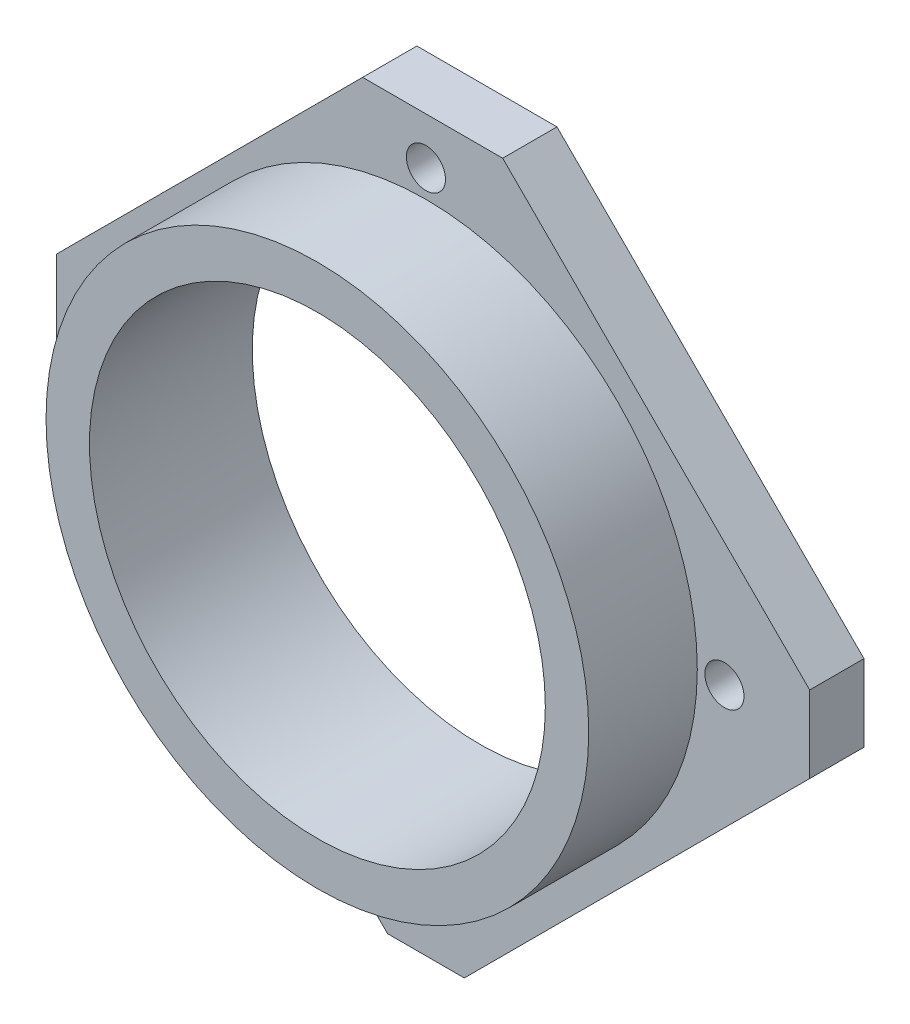
ISO-10303-21;
HEADER;
FILE_DESCRIPTION(('STEP AP214'),'2;1');
FILE_NAME('part.step','',(''),(''),'','','');
FILE_SCHEMA(('AUTOMOTIVE_DESIGN { 1 0 10303 214 1 1 1 1 }'));
ENDSEC;
DATA;
#1=APPLICATION_CONTEXT('core data for automotive mechanical design processes');
#2=APPLICATION_PROTOCOL_DEFINITION('international standard','automotive_design',2000,#1);
#3=PRODUCT_CONTEXT('',#1,'mechanical');
#4=PRODUCT('Part','Part','',(#3));
#5=PRODUCT_RELATED_PRODUCT_CATEGORY('part','',(#4));
#6=PRODUCT_DEFINITION_FORMATION('','',#4);
#7=PRODUCT_DEFINITION_CONTEXT('part definition',#1,'design');
#8=PRODUCT_DEFINITION('design','',#6,#7);
#9=PRODUCT_DEFINITION_SHAPE('','',#8);
#10=(LENGTH_UNIT() NAMED_UNIT(*) SI_UNIT(.MILLI.,.METRE.));
#11=(NAMED_UNIT(*) PLANE_ANGLE_UNIT() SI_UNIT($,.RADIAN.));
#12=(NAMED_UNIT(*) SI_UNIT($,.STERADIAN.) SOLID_ANGLE_UNIT());
#13=UNCERTAINTY_MEASURE_WITH_UNIT(LENGTH_MEASURE(1.E-05),#10,'distance_accuracy_value','');
#14=(GEOMETRIC_REPRESENTATION_CONTEXT(3) GLOBAL_UNCERTAINTY_ASSIGNED_CONTEXT((#13)) GLOBAL_UNIT_ASSIGNED_CONTEXT((#10,
#11,#12)) REPRESENTATION_CONTEXT('',''));
#15=CARTESIAN_POINT('',(0.,0.,0.));
#16=DIRECTION('',(0.,0.,1.));
#17=DIRECTION('',(1.,0.,0.));
#18=AXIS2_PLACEMENT_3D('',#15,#16,#17);
#19=CARTESIAN_POINT('',(0.,0.,5.));
#20=DIRECTION('',(0.,0.,1.));
#21=DIRECTION('',(1.,0.,0.));
#22=AXIS2_PLACEMENT_3D('',#19,#20,#21);
#23=PLANE('',#22);
#24=DIRECTION('',(0.,1.,0.));
#25=VECTOR('',#24,1.);
#26=CARTESIAN_POINT('',(-34.0291026007344,0.,5.));
#27=LINE('',#26,#25);
#28=CARTESIAN_POINT('',(-34.0291026007344,-4.86177036452587,5.));
#29=VERTEX_POINT('',#28);
#30=CARTESIAN_POINT('',(-34.0291026007344,3.6235110097127,5.));
#31=VERTEX_POINT('',#30);
#32=EDGE_CURVE('E194',#29,#31,#27,.T.);
#33=ORIENTED_EDGE('',*,*,#32,.F.);
#34=DIRECTION('',(-0.707106781186548,0.707106781186547,0.));
#35=VECTOR('',#34,1.);
#36=CARTESIAN_POINT('',(-19.4454364826301,-19.4454364826301,5.));
#37=LINE('',#36,#35);
#38=CARTESIAN_POINT('',(-3.53553390593292,-35.3553390593273,5.));
#39=VERTEX_POINT('',#38);
#40=EDGE_CURVE('E192',#39,#29,#37,.T.);
#41=ORIENTED_EDGE('',*,*,#40,.F.);
#42=DIRECTION('',(-1.,0.,0.));
#43=VECTOR('',#42,1.);
#44=CARTESIAN_POINT('',(1.3877787807814E-13,-35.3553390593273,5.));
#45=LINE('',#44,#43);
#46=CARTESIAN_POINT('',(3.53553390593275,-35.3553390593273,5.));
#47=VERTEX_POINT('',#46);
#48=EDGE_CURVE('E180',#47,#39,#45,.T.);
#49=ORIENTED_EDGE('',*,*,#48,.F.);
#50=DIRECTION('',(-0.707106781186548,-0.707106781186547,0.));
#51=VECTOR('',#50,1.);
#52=CARTESIAN_POINT('',(19.44543648263,-19.44543648263,5.));
#53=LINE('',#52,#51);
#54=CARTESIAN_POINT('',(35.3553390593275,-3.53553390593257,5.));
#55=VERTEX_POINT('',#54);
#56=EDGE_CURVE('E126',#55,#47,#53,.T.);
#57=ORIENTED_EDGE('',*,*,#56,.F.);
#58=DIRECTION('',(0.,-1.,0.));
#59=VECTOR('',#58,1.);
#60=CARTESIAN_POINT('',(35.3553390593276,-8.32667268468891E-13,5.));
#61=LINE('',#60,#59);
#62=CARTESIAN_POINT('',(35.3553390593276,3.53553390593274,5.));
#63=VERTEX_POINT('',#62);
#64=EDGE_CURVE('E124',#63,#55,#61,.T.);
#65=ORIENTED_EDGE('',*,*,#64,.F.);
#66=DIRECTION('',(0.707106781186547,-0.707106781186548,0.));
#67=VECTOR('',#66,1.);
#68=CARTESIAN_POINT('',(19.4454364826302,19.4454364826302,5.));
#69=LINE('',#68,#67);
#70=CARTESIAN_POINT('',(7.07106781186568,31.8198051533947,5.));
#71=VERTEX_POINT('',#70);
#72=EDGE_CURVE('E107',#71,#63,#69,.T.);
#73=ORIENTED_EDGE('',*,*,#72,.F.);
#74=DIRECTION('',(-1.,0.,0.));
#75=VECTOR('',#74,1.);
#76=CARTESIAN_POINT('',(0.,31.8198051533947,5.));
#77=LINE('',#76,#75);
#78=CARTESIAN_POINT('',(-5.83280845705236,31.8198051533947,5.));
#79=VERTEX_POINT('',#78);
#80=EDGE_CURVE('E114',#71,#79,#77,.T.);
#81=ORIENTED_EDGE('',*,*,#80,.T.);
#82=DIRECTION('',(0.707106781186548,0.707106781186547,0.));
#83=VECTOR('',#82,1.);
#84=CARTESIAN_POINT('',(-18.8263068052235,18.8263068052235,5.));
#85=LINE('',#84,#83);
#86=EDGE_CURVE('E118',#31,#79,#85,.T.);
#87=ORIENTED_EDGE('',*,*,#86,.F.);
#88=EDGE_LOOP('',(#33,#41,#49,#57,#65,#73,#81,#87));
#89=FACE_BOUND('',#88,.T.);
#90=CARTESIAN_POINT('',(27.5,0.,5.));
#91=DIRECTION('',(0.,0.,1.));
#92=DIRECTION('',(1.,0.,0.));
#93=AXIS2_PLACEMENT_3D('',#90,#91,#92);
#94=CIRCLE('',#93,1.8);
#95=CARTESIAN_POINT('',(29.3,0.,5.));
#96=VERTEX_POINT('',#95);
#97=EDGE_CURVE('E198',#96,#96,#94,.T.);
#98=ORIENTED_EDGE('',*,*,#97,.F.);
#99=EDGE_LOOP('',(#98));
#100=FACE_BOUND('',#99,.T.);
#101=CARTESIAN_POINT('',(0.,-27.5,5.));
#102=DIRECTION('',(0.,0.,1.));
#103=DIRECTION('',(1.,0.,0.));
#104=AXIS2_PLACEMENT_3D('',#101,#102,#103);
#105=CIRCLE('',#104,1.8);
#106=CARTESIAN_POINT('',(1.79999999999999,-27.5,5.));
#107=VERTEX_POINT('',#106);
#108=EDGE_CURVE('E201',#107,#107,#105,.T.);
#109=ORIENTED_EDGE('',*,*,#108,.F.);
#110=EDGE_LOOP('',(#109));
#111=FACE_BOUND('',#110,.T.);
#112=CARTESIAN_POINT('',(0.,27.5,5.));
#113=DIRECTION('',(0.,0.,1.));
#114=DIRECTION('',(1.,0.,0.));
#115=AXIS2_PLACEMENT_3D('',#112,#113,#114);
#116=CIRCLE('',#115,1.8);
#117=CARTESIAN_POINT('',(1.8,27.5,5.));
#118=VERTEX_POINT('',#117);
#119=EDGE_CURVE('E204',#118,#118,#116,.T.);
#120=ORIENTED_EDGE('',*,*,#119,.F.);
#121=EDGE_LOOP('',(#120));
#122=FACE_BOUND('',#121,.T.);
#123=CARTESIAN_POINT('',(-27.5,0.,5.));
#124=DIRECTION('',(0.,0.,1.));
#125=DIRECTION('',(1.,0.,0.));
#126=AXIS2_PLACEMENT_3D('',#123,#124,#125);
#127=CIRCLE('',#126,1.8);
#128=CARTESIAN_POINT('',(-25.7,0.,5.));
#129=VERTEX_POINT('',#128);
#130=EDGE_CURVE('E167',#129,#129,#127,.T.);
#131=ORIENTED_EDGE('',*,*,#130,.F.);
#132=EDGE_LOOP('',(#131));
#133=FACE_BOUND('',#132,.T.);
#134=CARTESIAN_POINT('',(0.,0.,5.));
#135=DIRECTION('',(0.,0.,1.));
#136=DIRECTION('',(1.,0.,0.));
#137=AXIS2_PLACEMENT_3D('',#134,#135,#136);
#138=CIRCLE('',#137,25.);
#139=CARTESIAN_POINT('',(25.,0.,5.));
#140=VERTEX_POINT('',#139);
#141=EDGE_CURVE('E209',#140,#140,#138,.T.);
#142=ORIENTED_EDGE('',*,*,#141,.F.);
#143=EDGE_LOOP('',(#142));
#144=FACE_BOUND('',#143,.T.);
#145=ADVANCED_FACE('F35',(#89,#100,#111,#122,#133,#144),#23,.T.);
#146=CARTESIAN_POINT('',(-34.0291026007344,0.,5.));
#147=DIRECTION('',(-1.,0.,0.));
#148=DIRECTION('',(0.,0.,1.));
#149=AXIS2_PLACEMENT_3D('',#146,#147,#148);
#150=PLANE('',#149);
#151=DIRECTION('',(0.,1.,0.));
#152=VECTOR('',#151,1.);
#153=CARTESIAN_POINT('',(-34.0291026007344,0.,0.));
#154=LINE('',#153,#152);
#155=CARTESIAN_POINT('',(-34.0291026007344,-4.86177036452587,0.));
#156=VERTEX_POINT('',#155);
#157=CARTESIAN_POINT('',(-34.0291026007344,3.6235110097127,0.));
#158=VERTEX_POINT('',#157);
#159=EDGE_CURVE('E147',#156,#158,#154,.T.);
#160=ORIENTED_EDGE('',*,*,#159,.F.);
#161=DIRECTION('',(0.,0.,-1.));
#162=VECTOR('',#161,1.);
#163=CARTESIAN_POINT('',(-34.0291026007344,-4.86177036452587,5.));
#164=LINE('',#163,#162);
#165=EDGE_CURVE('E11',#29,#156,#164,.T.);
#166=ORIENTED_EDGE('',*,*,#165,.F.);
#167=ORIENTED_EDGE('',*,*,#32,.T.);
#168=DIRECTION('',(0.,0.,-1.));
#169=VECTOR('',#168,1.);
#170=CARTESIAN_POINT('',(-34.0291026007344,3.6235110097127,5.));
#171=LINE('',#170,#169);
#172=EDGE_CURVE('E52',#31,#158,#171,.T.);
#173=ORIENTED_EDGE('',*,*,#172,.T.);
#174=EDGE_LOOP('',(#160,#166,#167,#173));
#175=FACE_BOUND('',#174,.T.);
#176=ADVANCED_FACE('F235',(#175),#150,.T.);
#177=CARTESIAN_POINT('',(-19.4454364826301,-19.4454364826301,5.));
#178=DIRECTION('',(-0.707106781186547,-0.707106781186548,0.));
#179=DIRECTION('',(0.707106781186548,-0.707106781186547,0.));
#180=AXIS2_PLACEMENT_3D('',#177,#178,#179);
#181=PLANE('',#180);
#182=DIRECTION('',(-0.707106781186548,0.707106781186547,0.));
#183=VECTOR('',#182,1.);
#184=CARTESIAN_POINT('',(-19.4454364826301,-19.4454364826301,0.));
#185=LINE('',#184,#183);
#186=CARTESIAN_POINT('',(-3.53553390593292,-35.3553390593273,0.));
#187=VERTEX_POINT('',#186);
#188=EDGE_CURVE('E149',#187,#156,#185,.T.);
#189=ORIENTED_EDGE('',*,*,#188,.F.);
#190=DIRECTION('',(0.,0.,-1.));
#191=VECTOR('',#190,1.);
#192=CARTESIAN_POINT('',(-3.53553390593292,-35.3553390593273,5.));
#193=LINE('',#192,#191);
#194=EDGE_CURVE('E44',#39,#187,#193,.T.);
#195=ORIENTED_EDGE('',*,*,#194,.F.);
#196=ORIENTED_EDGE('',*,*,#40,.T.);
#197=ORIENTED_EDGE('',*,*,#165,.T.);
#198=EDGE_LOOP('',(#189,#195,#196,#197));
#199=FACE_BOUND('',#198,.T.);
#200=ADVANCED_FACE('F184',(#199),#181,.T.);
#201=CARTESIAN_POINT('',(1.3877787807814E-13,-35.3553390593273,5.));
#202=DIRECTION('',(0.,-1.,0.));
#203=DIRECTION('',(1.,0.,0.));
#204=AXIS2_PLACEMENT_3D('',#201,#202,#203);
#205=PLANE('',#204);
#206=DIRECTION('',(-1.,0.,0.));
#207=VECTOR('',#206,1.);
#208=CARTESIAN_POINT('',(1.3877787807814E-13,-35.3553390593273,0.));
#209=LINE('',#208,#207);
#210=CARTESIAN_POINT('',(3.53553390593275,-35.3553390593273,0.));
#211=VERTEX_POINT('',#210);
#212=EDGE_CURVE('E152',#211,#187,#209,.T.);
#213=ORIENTED_EDGE('',*,*,#212,.F.);
#214=DIRECTION('',(0.,0.,-1.));
#215=VECTOR('',#214,1.);
#216=CARTESIAN_POINT('',(3.53553390593275,-35.3553390593273,5.));
#217=LINE('',#216,#215);
#218=EDGE_CURVE('E173',#47,#211,#217,.T.);
#219=ORIENTED_EDGE('',*,*,#218,.F.);
#220=ORIENTED_EDGE('',*,*,#48,.T.);
#221=ORIENTED_EDGE('',*,*,#194,.T.);
#222=EDGE_LOOP('',(#213,#219,#220,#221));
#223=FACE_BOUND('',#222,.T.);
#224=ADVANCED_FACE('F178',(#223),#205,.T.);
#225=CARTESIAN_POINT('',(19.44543648263,-19.44543648263,5.));
#226=DIRECTION('',(0.707106781186547,-0.707106781186548,0.));
#227=DIRECTION('',(0.707106781186548,0.707106781186547,0.));
#228=AXIS2_PLACEMENT_3D('',#225,#226,#227);
#229=PLANE('',#228);
#230=DIRECTION('',(-0.707106781186548,-0.707106781186547,0.));
#231=VECTOR('',#230,1.);
#232=CARTESIAN_POINT('',(19.44543648263,-19.44543648263,0.));
#233=LINE('',#232,#231);
#234=CARTESIAN_POINT('',(35.3553390593275,-3.53553390593257,0.));
#235=VERTEX_POINT('',#234);
#236=EDGE_CURVE('E155',#235,#211,#233,.T.);
#237=ORIENTED_EDGE('',*,*,#236,.F.);
#238=DIRECTION('',(0.,0.,-1.));
#239=VECTOR('',#238,1.);
#240=CARTESIAN_POINT('',(35.3553390593275,-3.53553390593257,5.));
#241=LINE('',#240,#239);
#242=EDGE_CURVE('E171',#55,#235,#241,.T.);
#243=ORIENTED_EDGE('',*,*,#242,.F.);
#244=ORIENTED_EDGE('',*,*,#56,.T.);
#245=ORIENTED_EDGE('',*,*,#218,.T.);
#246=EDGE_LOOP('',(#237,#243,#244,#245));
#247=FACE_BOUND('',#246,.T.);
#248=ADVANCED_FACE('F190',(#247),#229,.T.);
#249=CARTESIAN_POINT('',(35.3553390593276,-8.32667268468891E-13,5.));
#250=DIRECTION('',(1.,0.,0.));
#251=DIRECTION('',(0.,1.,0.));
#252=AXIS2_PLACEMENT_3D('',#249,#250,#251);
#253=PLANE('',#252);
#254=DIRECTION('',(0.,-1.,0.));
#255=VECTOR('',#254,1.);
#256=CARTESIAN_POINT('',(35.3553390593276,-8.32667268468891E-13,0.));
#257=LINE('',#256,#255);
#258=CARTESIAN_POINT('',(35.3553390593276,3.53553390593274,0.));
#259=VERTEX_POINT('',#258);
#260=EDGE_CURVE('E158',#259,#235,#257,.T.);
#261=ORIENTED_EDGE('',*,*,#260,.F.);
#262=DIRECTION('',(0.,0.,-1.));
#263=VECTOR('',#262,1.);
#264=CARTESIAN_POINT('',(35.3553390593276,3.53553390593274,5.));
#265=LINE('',#264,#263);
#266=EDGE_CURVE('E112',#63,#259,#265,.T.);
#267=ORIENTED_EDGE('',*,*,#266,.F.);
#268=ORIENTED_EDGE('',*,*,#64,.T.);
#269=ORIENTED_EDGE('',*,*,#242,.T.);
#270=EDGE_LOOP('',(#261,#267,#268,#269));
#271=FACE_BOUND('',#270,.T.);
#272=ADVANCED_FACE('F249',(#271),#253,.T.);
#273=CARTESIAN_POINT('',(19.4454364826302,19.4454364826302,5.));
#274=DIRECTION('',(0.707106781186548,0.707106781186547,0.));
#275=DIRECTION('',(-0.707106781186547,0.707106781186548,0.));
#276=AXIS2_PLACEMENT_3D('',#273,#274,#275);
#277=PLANE('',#276);
#278=DIRECTION('',(0.707106781186547,-0.707106781186548,0.));
#279=VECTOR('',#278,1.);
#280=CARTESIAN_POINT('',(19.4454364826302,19.4454364826302,0.));
#281=LINE('',#280,#279);
#282=CARTESIAN_POINT('',(7.07106781186568,31.8198051533947,0.));
#283=VERTEX_POINT('',#282);
#284=EDGE_CURVE('E109',#283,#259,#281,.T.);
#285=ORIENTED_EDGE('',*,*,#284,.F.);
#286=DIRECTION('',(0.,0.,-1.));
#287=VECTOR('',#286,1.);
#288=CARTESIAN_POINT('',(7.07106781186568,31.8198051533947,5.));
#289=LINE('',#288,#287);
#290=EDGE_CURVE('E103',#71,#283,#289,.T.);
#291=ORIENTED_EDGE('',*,*,#290,.F.);
#292=ORIENTED_EDGE('',*,*,#72,.T.);
#293=ORIENTED_EDGE('',*,*,#266,.T.);
#294=EDGE_LOOP('',(#285,#291,#292,#293));
#295=FACE_BOUND('',#294,.T.);
#296=ADVANCED_FACE('F105',(#295),#277,.T.);
#297=CARTESIAN_POINT('',(0.,31.8198051533947,5.));
#298=DIRECTION('',(0.,-1.,0.));
#299=DIRECTION('',(0.,0.,-1.));
#300=AXIS2_PLACEMENT_3D('',#297,#298,#299);
#301=PLANE('',#300);
#302=DIRECTION('',(-1.,0.,0.));
#303=VECTOR('',#302,1.);
#304=CARTESIAN_POINT('',(0.,31.8198051533947,0.));
#305=LINE('',#304,#303);
#306=CARTESIAN_POINT('',(-5.83280845705236,31.8198051533947,0.));
#307=VERTEX_POINT('',#306);
#308=EDGE_CURVE('E162',#283,#307,#305,.T.);
#309=ORIENTED_EDGE('',*,*,#308,.T.);
#310=DIRECTION('',(0.,0.,-1.));
#311=VECTOR('',#310,1.);
#312=CARTESIAN_POINT('',(-5.83280845705236,31.8198051533947,5.));
#313=LINE('',#312,#311);
#314=EDGE_CURVE('E78',#79,#307,#313,.T.);
#315=ORIENTED_EDGE('',*,*,#314,.F.);
#316=ORIENTED_EDGE('',*,*,#80,.F.);
#317=ORIENTED_EDGE('',*,*,#290,.T.);
#318=EDGE_LOOP('',(#309,#315,#316,#317));
#319=FACE_BOUND('',#318,.T.);
#320=ADVANCED_FACE('F115',(#319),#301,.F.);
#321=CARTESIAN_POINT('',(27.5,0.,5.));
#322=DIRECTION('',(0.,0.,-1.));
#323=DIRECTION('',(-1.,0.,0.));
#324=AXIS2_PLACEMENT_3D('',#321,#322,#323);
#325=CYLINDRICAL_SURFACE('',#324,1.8);
#326=ORIENTED_EDGE('',*,*,#97,.T.);
#327=EDGE_LOOP('',(#326));
#328=FACE_BOUND('',#327,.T.);
#329=CARTESIAN_POINT('',(27.5,0.,0.));
#330=DIRECTION('',(0.,0.,1.));
#331=DIRECTION('',(1.,0.,0.));
#332=AXIS2_PLACEMENT_3D('',#329,#330,#331);
#333=CIRCLE('',#332,1.8);
#334=CARTESIAN_POINT('',(29.3,0.,0.));
#335=VERTEX_POINT('',#334);
#336=EDGE_CURVE('E144',#335,#335,#333,.T.);
#337=ORIENTED_EDGE('',*,*,#336,.F.);
#338=EDGE_LOOP('',(#337));
#339=FACE_BOUND('',#338,.T.);
#340=ADVANCED_FACE('F246',(#328,#339),#325,.F.);
#341=CARTESIAN_POINT('',(0.,-27.5,5.));
#342=DIRECTION('',(0.,0.,-1.));
#343=DIRECTION('',(-1.,0.,0.));
#344=AXIS2_PLACEMENT_3D('',#341,#342,#343);
#345=CYLINDRICAL_SURFACE('',#344,1.8);
#346=ORIENTED_EDGE('',*,*,#108,.T.);
#347=EDGE_LOOP('',(#346));
#348=FACE_BOUND('',#347,.T.);
#349=CARTESIAN_POINT('',(0.,-27.5,0.));
#350=DIRECTION('',(0.,0.,1.));
#351=DIRECTION('',(1.,0.,0.));
#352=AXIS2_PLACEMENT_3D('',#349,#350,#351);
#353=CIRCLE('',#352,1.8);
#354=CARTESIAN_POINT('',(1.79999999999999,-27.5,0.));
#355=VERTEX_POINT('',#354);
#356=EDGE_CURVE('E141',#355,#355,#353,.T.);
#357=ORIENTED_EDGE('',*,*,#356,.F.);
#358=EDGE_LOOP('',(#357));
#359=FACE_BOUND('',#358,.T.);
#360=ADVANCED_FACE('F261',(#348,#359),#345,.F.);
#361=CARTESIAN_POINT('',(0.,27.5,5.));
#362=DIRECTION('',(0.,0.,-1.));
#363=DIRECTION('',(-1.,0.,0.));
#364=AXIS2_PLACEMENT_3D('',#361,#362,#363);
#365=CYLINDRICAL_SURFACE('',#364,1.8);
#366=ORIENTED_EDGE('',*,*,#119,.T.);
#367=EDGE_LOOP('',(#366));
#368=FACE_BOUND('',#367,.T.);
#369=CARTESIAN_POINT('',(0.,27.5,0.));
#370=DIRECTION('',(0.,0.,1.));
#371=DIRECTION('',(1.,0.,0.));
#372=AXIS2_PLACEMENT_3D('',#369,#370,#371);
#373=CIRCLE('',#372,1.8);
#374=CARTESIAN_POINT('',(1.8,27.5,0.));
#375=VERTEX_POINT('',#374);
#376=EDGE_CURVE('E138',#375,#375,#373,.T.);
#377=ORIENTED_EDGE('',*,*,#376,.F.);
#378=EDGE_LOOP('',(#377));
#379=FACE_BOUND('',#378,.T.);
#380=ADVANCED_FACE('F265',(#368,#379),#365,.F.);
#381=CARTESIAN_POINT('',(0.,0.,5.));
#382=DIRECTION('',(0.,0.,-1.));
#383=DIRECTION('',(-1.,0.,0.));
#384=AXIS2_PLACEMENT_3D('',#381,#382,#383);
#385=CYLINDRICAL_SURFACE('',#384,21.);
#386=CARTESIAN_POINT('',(0.,0.,0.));
#387=DIRECTION('',(0.,0.,1.));
#388=DIRECTION('',(1.,0.,0.));
#389=AXIS2_PLACEMENT_3D('',#386,#387,#388);
#390=CIRCLE('',#389,21.);
#391=CARTESIAN_POINT('',(21.,0.,0.));
#392=VERTEX_POINT('',#391);
#393=EDGE_CURVE('E134',#392,#392,#390,.T.);
#394=ORIENTED_EDGE('',*,*,#393,.F.);
#395=EDGE_LOOP('',(#394));
#396=FACE_BOUND('',#395,.T.);
#397=CARTESIAN_POINT('',(0.,0.,15.));
#398=DIRECTION('',(0.,0.,1.));
#399=DIRECTION('',(1.,0.,0.));
#400=AXIS2_PLACEMENT_3D('',#397,#398,#399);
#401=CIRCLE('',#400,21.);
#402=CARTESIAN_POINT('',(21.,0.,15.));
#403=VERTEX_POINT('',#402);
#404=EDGE_CURVE('E212',#403,#403,#401,.T.);
#405=ORIENTED_EDGE('',*,*,#404,.T.);
#406=EDGE_LOOP('',(#405));
#407=FACE_BOUND('',#406,.T.);
#408=ADVANCED_FACE('F218',(#396,#407),#385,.F.);
#409=CARTESIAN_POINT('',(-27.5,0.,5.));
#410=DIRECTION('',(0.,0.,-1.));
#411=DIRECTION('',(-1.,0.,0.));
#412=AXIS2_PLACEMENT_3D('',#409,#410,#411);
#413=CYLINDRICAL_SURFACE('',#412,1.8);
#414=ORIENTED_EDGE('',*,*,#130,.T.);
#415=EDGE_LOOP('',(#414));
#416=FACE_BOUND('',#415,.T.);
#417=CARTESIAN_POINT('',(-27.5,0.,0.));
#418=DIRECTION('',(0.,0.,1.));
#419=DIRECTION('',(1.,0.,0.));
#420=AXIS2_PLACEMENT_3D('',#417,#418,#419);
#421=CIRCLE('',#420,1.8);
#422=CARTESIAN_POINT('',(-25.7,0.,0.));
#423=VERTEX_POINT('',#422);
#424=EDGE_CURVE('E131',#423,#423,#421,.T.);
#425=ORIENTED_EDGE('',*,*,#424,.F.);
#426=EDGE_LOOP('',(#425));
#427=FACE_BOUND('',#426,.T.);
#428=ADVANCED_FACE('F37',(#416,#427),#413,.F.);
#429=CARTESIAN_POINT('',(-18.8263068052235,18.8263068052235,5.));
#430=DIRECTION('',(-0.707106781186547,0.707106781186548,0.));
#431=DIRECTION('',(-0.707106781186548,-0.707106781186547,0.));
#432=AXIS2_PLACEMENT_3D('',#429,#430,#431);
#433=PLANE('',#432);
#434=DIRECTION('',(0.707106781186548,0.707106781186547,0.));
#435=VECTOR('',#434,1.);
#436=CARTESIAN_POINT('',(-18.8263068052235,18.8263068052235,0.));
#437=LINE('',#436,#435);
#438=EDGE_CURVE('E164',#158,#307,#437,.T.);
#439=ORIENTED_EDGE('',*,*,#438,.F.);
#440=ORIENTED_EDGE('',*,*,#172,.F.);
#441=ORIENTED_EDGE('',*,*,#86,.T.);
#442=ORIENTED_EDGE('',*,*,#314,.T.);
#443=EDGE_LOOP('',(#439,#440,#441,#442));
#444=FACE_BOUND('',#443,.T.);
#445=ADVANCED_FACE('F231',(#444),#433,.T.);
#446=CARTESIAN_POINT('',(0.,0.,0.));
#447=DIRECTION('',(0.,0.,1.));
#448=DIRECTION('',(1.,0.,0.));
#449=AXIS2_PLACEMENT_3D('',#446,#447,#448);
#450=PLANE('',#449);
#451=ORIENTED_EDGE('',*,*,#424,.T.);
#452=EDGE_LOOP('',(#451));
#453=FACE_BOUND('',#452,.T.);
#454=ORIENTED_EDGE('',*,*,#393,.T.);
#455=EDGE_LOOP('',(#454));
#456=FACE_BOUND('',#455,.T.);
#457=ORIENTED_EDGE('',*,*,#376,.T.);
#458=EDGE_LOOP('',(#457));
#459=FACE_BOUND('',#458,.T.);
#460=ORIENTED_EDGE('',*,*,#356,.T.);
#461=EDGE_LOOP('',(#460));
#462=FACE_BOUND('',#461,.T.);
#463=ORIENTED_EDGE('',*,*,#336,.T.);
#464=EDGE_LOOP('',(#463));
#465=FACE_BOUND('',#464,.T.);
#466=ORIENTED_EDGE('',*,*,#159,.T.);
#467=ORIENTED_EDGE('',*,*,#438,.T.);
#468=ORIENTED_EDGE('',*,*,#308,.F.);
#469=ORIENTED_EDGE('',*,*,#284,.T.);
#470=ORIENTED_EDGE('',*,*,#260,.T.);
#471=ORIENTED_EDGE('',*,*,#236,.T.);
#472=ORIENTED_EDGE('',*,*,#212,.T.);
#473=ORIENTED_EDGE('',*,*,#188,.T.);
#474=EDGE_LOOP('',(#466,#467,#468,#469,#470,#471,#472,#473));
#475=FACE_BOUND('',#474,.T.);
#476=ADVANCED_FACE('F186',(#453,#456,#459,#462,#465,#475),#450,.F.);
#477=CARTESIAN_POINT('',(0.,0.,15.));
#478=DIRECTION('',(0.,0.,1.));
#479=DIRECTION('',(1.,0.,0.));
#480=AXIS2_PLACEMENT_3D('',#477,#478,#479);
#481=PLANE('',#480);
#482=CARTESIAN_POINT('',(0.,0.,15.));
#483=DIRECTION('',(0.,0.,1.));
#484=DIRECTION('',(1.,0.,0.));
#485=AXIS2_PLACEMENT_3D('',#482,#483,#484);
#486=CIRCLE('',#485,25.);
#487=CARTESIAN_POINT('',(25.,0.,15.));
#488=VERTEX_POINT('',#487);
#489=EDGE_CURVE('E135',#488,#488,#486,.T.);
#490=ORIENTED_EDGE('',*,*,#489,.T.);
#491=EDGE_LOOP('',(#490));
#492=FACE_BOUND('',#491,.T.);
#493=ORIENTED_EDGE('',*,*,#404,.F.);
#494=EDGE_LOOP('',(#493));
#495=FACE_BOUND('',#494,.T.);
#496=ADVANCED_FACE('F220',(#492,#495),#481,.T.);
#497=CARTESIAN_POINT('',(0.,0.,15.));
#498=DIRECTION('',(0.,0.,-1.));
#499=DIRECTION('',(-1.,0.,0.));
#500=AXIS2_PLACEMENT_3D('',#497,#498,#499);
#501=CYLINDRICAL_SURFACE('',#500,25.);
#502=ORIENTED_EDGE('',*,*,#489,.F.);
#503=EDGE_LOOP('',(#502));
#504=FACE_BOUND('',#503,.T.);
#505=ORIENTED_EDGE('',*,*,#141,.T.);
#506=EDGE_LOOP('',(#505));
#507=FACE_BOUND('',#506,.T.);
#508=ADVANCED_FACE('F222',(#504,#507),#501,.T.);
#509=CLOSED_SHELL('',(#145,#176,#200,#224,#248,#272,#296,#320,#340,#360,#380,#408,#428,#445,
#476,#496,#508));
#510=MANIFOLD_SOLID_BREP('B2',#509);
#511=ADVANCED_BREP_SHAPE_REPRESENTATION('',(#18,#510),#14);
#512=SHAPE_DEFINITION_REPRESENTATION(#9,#511);
ENDSEC;
END-ISO-10303-21;
